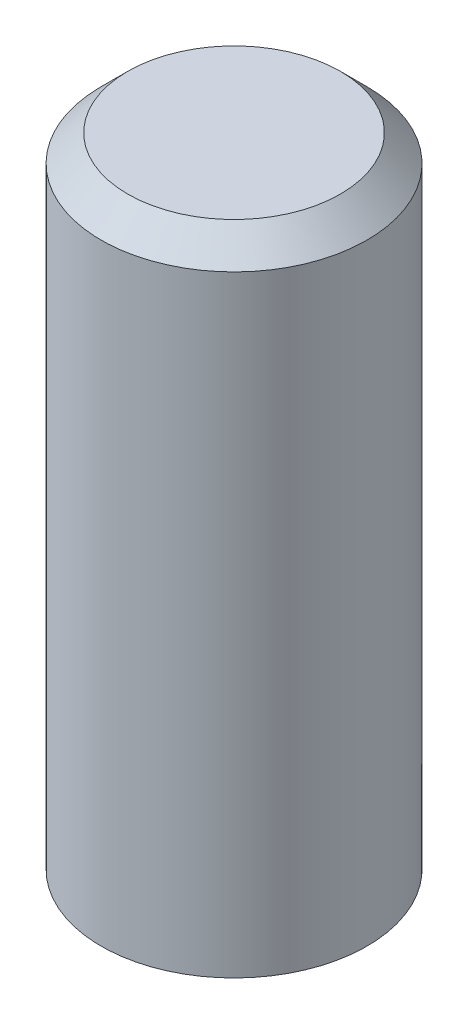
ISO-10303-21;
HEADER;
FILE_DESCRIPTION(('STEP AP214'),'2;1');
FILE_NAME('part.step','',(''),(''),'','','');
FILE_SCHEMA(('AUTOMOTIVE_DESIGN { 1 0 10303 214 1 1 1 1 }'));
ENDSEC;
DATA;
#1=APPLICATION_CONTEXT('core data for automotive mechanical design processes');
#2=APPLICATION_PROTOCOL_DEFINITION('international standard','automotive_design',2000,#1);
#3=PRODUCT_CONTEXT('',#1,'mechanical');
#4=PRODUCT('Part','Part','',(#3));
#5=PRODUCT_RELATED_PRODUCT_CATEGORY('part','',(#4));
#6=PRODUCT_DEFINITION_FORMATION('','',#4);
#7=PRODUCT_DEFINITION_CONTEXT('part definition',#1,'design');
#8=PRODUCT_DEFINITION('design','',#6,#7);
#9=PRODUCT_DEFINITION_SHAPE('','',#8);
#10=(LENGTH_UNIT() NAMED_UNIT(*) SI_UNIT(.MILLI.,.METRE.));
#11=(NAMED_UNIT(*) PLANE_ANGLE_UNIT() SI_UNIT($,.RADIAN.));
#12=(NAMED_UNIT(*) SI_UNIT($,.STERADIAN.) SOLID_ANGLE_UNIT());
#13=UNCERTAINTY_MEASURE_WITH_UNIT(LENGTH_MEASURE(1.E-05),#10,'distance_accuracy_value','');
#14=(GEOMETRIC_REPRESENTATION_CONTEXT(3) GLOBAL_UNCERTAINTY_ASSIGNED_CONTEXT((#13)) GLOBAL_UNIT_ASSIGNED_CONTEXT((#10,
#11,#12)) REPRESENTATION_CONTEXT('',''));
#15=CARTESIAN_POINT('',(0.,0.,0.));
#16=DIRECTION('',(0.,0.,1.));
#17=DIRECTION('',(1.,0.,0.));
#18=AXIS2_PLACEMENT_3D('',#15,#16,#17);
#19=CARTESIAN_POINT('',(0.,6.096,0.));
#20=DIRECTION('',(0.,1.,0.));
#21=DIRECTION('',(0.,0.,1.));
#22=AXIS2_PLACEMENT_3D('',#19,#20,#21);
#23=PLANE('',#22);
#24=CARTESIAN_POINT('',(0.,6.0959999999568,0.));
#25=DIRECTION('',(0.,-1.,0.));
#26=DIRECTION('',(0.,0.,-1.));
#27=AXIS2_PLACEMENT_3D('',#24,#25,#26);
#28=CIRCLE('',#27,1.01599999993596);
#29=CARTESIAN_POINT('',(0.,6.0959999999568,-1.01599999993596));
#30=VERTEX_POINT('',#29);
#31=EDGE_CURVE('E18',#30,#30,#28,.T.);
#32=ORIENTED_EDGE('',*,*,#31,.F.);
#33=EDGE_LOOP('',(#32));
#34=FACE_BOUND('',#33,.T.);
#35=ADVANCED_FACE('F15',(#34),#23,.T.);
#36=CARTESIAN_POINT('',(0.,5.84199999997281,0.));
#37=DIRECTION('',(0.,-1.,0.));
#38=DIRECTION('',(0.,0.,-1.));
#39=AXIS2_PLACEMENT_3D('',#36,#37,#38);
#40=CONICAL_SURFACE('',#39,1.26999999991995,0.785398163397448);
#41=CARTESIAN_POINT('',(0.,5.842,0.));
#42=DIRECTION('',(0.,-1.,0.));
#43=DIRECTION('',(0.,0.,-1.));
#44=AXIS2_PLACEMENT_3D('',#41,#42,#43);
#45=CIRCLE('',#44,1.27);
#46=CARTESIAN_POINT('',(0.,5.842,-1.27));
#47=VERTEX_POINT('',#46);
#48=EDGE_CURVE('E22',#47,#47,#45,.T.);
#49=ORIENTED_EDGE('',*,*,#48,.F.);
#50=EDGE_LOOP('',(#49));
#51=FACE_BOUND('',#50,.T.);
#52=ORIENTED_EDGE('',*,*,#31,.T.);
#53=EDGE_LOOP('',(#52));
#54=FACE_BOUND('',#53,.T.);
#55=ADVANCED_FACE('F32',(#51,#54),#40,.T.);
#56=CARTESIAN_POINT('',(0.,0.,0.));
#57=DIRECTION('',(0.,1.,0.));
#58=DIRECTION('',(0.,0.,1.));
#59=AXIS2_PLACEMENT_3D('',#56,#57,#58);
#60=PLANE('',#59);
#61=CARTESIAN_POINT('',(0.,0.,0.));
#62=DIRECTION('',(0.,-1.,0.));
#63=DIRECTION('',(0.,0.,-1.));
#64=AXIS2_PLACEMENT_3D('',#61,#62,#63);
#65=CIRCLE('',#64,1.27);
#66=CARTESIAN_POINT('',(0.,0.,-1.27));
#67=VERTEX_POINT('',#66);
#68=EDGE_CURVE('E10',#67,#67,#65,.F.);
#69=ORIENTED_EDGE('',*,*,#68,.F.);
#70=EDGE_LOOP('',(#69));
#71=FACE_BOUND('',#70,.T.);
#72=ADVANCED_FACE('F39',(#71),#60,.F.);
#73=CARTESIAN_POINT('',(0.,6.096,0.));
#74=DIRECTION('',(0.,-1.,0.));
#75=DIRECTION('',(0.,0.,-1.));
#76=AXIS2_PLACEMENT_3D('',#73,#74,#75);
#77=CYLINDRICAL_SURFACE('',#76,1.27);
#78=ORIENTED_EDGE('',*,*,#68,.T.);
#79=EDGE_LOOP('',(#78));
#80=FACE_BOUND('',#79,.T.);
#81=ORIENTED_EDGE('',*,*,#48,.T.);
#82=EDGE_LOOP('',(#81));
#83=FACE_BOUND('',#82,.T.);
#84=ADVANCED_FACE('F41',(#80,#83),#77,.T.);
#85=CLOSED_SHELL('',(#35,#55,#72,#84));
#86=MANIFOLD_SOLID_BREP('B1',#85);
#87=ADVANCED_BREP_SHAPE_REPRESENTATION('',(#18,#86),#14);
#88=SHAPE_DEFINITION_REPRESENTATION(#9,#87);
ENDSEC;
END-ISO-10303-21;
